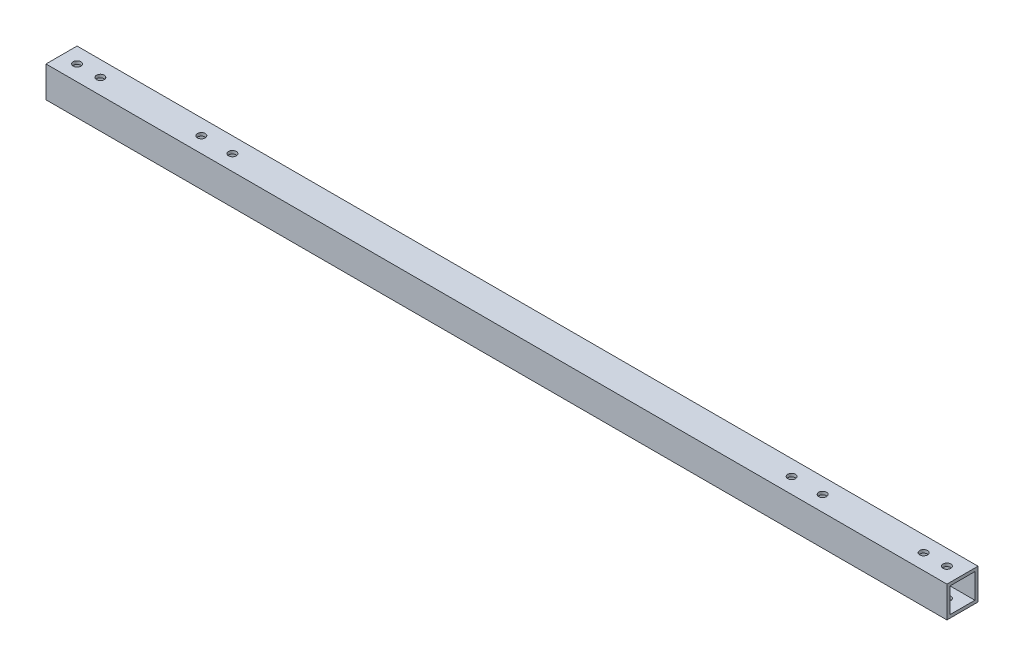
ISO-10303-21;
HEADER;
FILE_DESCRIPTION(('STEP AP214'),'2;1');
FILE_NAME('part.step','',(''),(''),'','','');
FILE_SCHEMA(('AUTOMOTIVE_DESIGN { 1 0 10303 214 1 1 1 1 }'));
ENDSEC;
DATA;
#1=APPLICATION_CONTEXT('core data for automotive mechanical design processes');
#2=APPLICATION_PROTOCOL_DEFINITION('international standard','automotive_design',2000,#1);
#3=PRODUCT_CONTEXT('',#1,'mechanical');
#4=PRODUCT('Part','Part','',(#3));
#5=PRODUCT_RELATED_PRODUCT_CATEGORY('part','',(#4));
#6=PRODUCT_DEFINITION_FORMATION('','',#4);
#7=PRODUCT_DEFINITION_CONTEXT('part definition',#1,'design');
#8=PRODUCT_DEFINITION('design','',#6,#7);
#9=PRODUCT_DEFINITION_SHAPE('','',#8);
#10=(LENGTH_UNIT() NAMED_UNIT(*) SI_UNIT(.MILLI.,.METRE.));
#11=(NAMED_UNIT(*) PLANE_ANGLE_UNIT() SI_UNIT($,.RADIAN.));
#12=(NAMED_UNIT(*) SI_UNIT($,.STERADIAN.) SOLID_ANGLE_UNIT());
#13=UNCERTAINTY_MEASURE_WITH_UNIT(LENGTH_MEASURE(1.E-05),#10,'distance_accuracy_value','');
#14=(GEOMETRIC_REPRESENTATION_CONTEXT(3) GLOBAL_UNCERTAINTY_ASSIGNED_CONTEXT((#13)) GLOBAL_UNIT_ASSIGNED_CONTEXT((#10,
#11,#12)) REPRESENTATION_CONTEXT('',''));
#15=CARTESIAN_POINT('',(0.,0.,0.));
#16=DIRECTION('',(0.,0.,1.));
#17=DIRECTION('',(1.,0.,0.));
#18=AXIS2_PLACEMENT_3D('',#15,#16,#17);
#19=CARTESIAN_POINT('',(580.,0.,0.));
#20=DIRECTION('',(1.,0.,0.));
#21=DIRECTION('',(0.,0.,-1.));
#22=AXIS2_PLACEMENT_3D('',#19,#20,#21);
#23=PLANE('',#22);
#24=DIRECTION('',(0.,1.,0.));
#25=VECTOR('',#24,1.);
#26=CARTESIAN_POINT('',(580.,10.,-9.99999999999999));
#27=LINE('',#26,#25);
#28=CARTESIAN_POINT('',(580.,-10.,-10.));
#29=VERTEX_POINT('',#28);
#30=CARTESIAN_POINT('',(580.,10.,-9.99999999999999));
#31=VERTEX_POINT('',#30);
#32=EDGE_CURVE('E141',#29,#31,#27,.T.);
#33=ORIENTED_EDGE('',*,*,#32,.T.);
#34=DIRECTION('',(0.,0.,1.));
#35=VECTOR('',#34,1.);
#36=CARTESIAN_POINT('',(580.,10.,10.));
#37=LINE('',#36,#35);
#38=CARTESIAN_POINT('',(580.,10.,10.));
#39=VERTEX_POINT('',#38);
#40=EDGE_CURVE('E144',#31,#39,#37,.T.);
#41=ORIENTED_EDGE('',*,*,#40,.T.);
#42=DIRECTION('',(0.,-1.,0.));
#43=VECTOR('',#42,1.);
#44=CARTESIAN_POINT('',(580.,10.,10.));
#45=LINE('',#44,#43);
#46=CARTESIAN_POINT('',(580.,-10.,10.));
#47=VERTEX_POINT('',#46);
#48=EDGE_CURVE('E147',#39,#47,#45,.T.);
#49=ORIENTED_EDGE('',*,*,#48,.T.);
#50=DIRECTION('',(0.,0.,-1.));
#51=VECTOR('',#50,1.);
#52=CARTESIAN_POINT('',(580.,-10.,10.));
#53=LINE('',#52,#51);
#54=EDGE_CURVE('E149',#47,#29,#53,.T.);
#55=ORIENTED_EDGE('',*,*,#54,.T.);
#56=EDGE_LOOP('',(#33,#41,#49,#55));
#57=FACE_BOUND('',#56,.T.);
#58=DIRECTION('',(0.,0.,1.));
#59=VECTOR('',#58,1.);
#60=CARTESIAN_POINT('',(580.,8.,8.));
#61=LINE('',#60,#59);
#62=CARTESIAN_POINT('',(580.,8.,-8.));
#63=VERTEX_POINT('',#62);
#64=CARTESIAN_POINT('',(580.,8.,8.));
#65=VERTEX_POINT('',#64);
#66=EDGE_CURVE('E111',#63,#65,#61,.T.);
#67=ORIENTED_EDGE('',*,*,#66,.F.);
#68=DIRECTION('',(0.,1.,0.));
#69=VECTOR('',#68,1.);
#70=CARTESIAN_POINT('',(580.,8.,-8.));
#71=LINE('',#70,#69);
#72=CARTESIAN_POINT('',(580.,-8.,-8.));
#73=VERTEX_POINT('',#72);
#74=EDGE_CURVE('E103',#73,#63,#71,.T.);
#75=ORIENTED_EDGE('',*,*,#74,.F.);
#76=DIRECTION('',(0.,0.,-1.));
#77=VECTOR('',#76,1.);
#78=CARTESIAN_POINT('',(580.,-8.,8.));
#79=LINE('',#78,#77);
#80=CARTESIAN_POINT('',(580.,-8.,8.));
#81=VERTEX_POINT('',#80);
#82=EDGE_CURVE('E125',#81,#73,#79,.T.);
#83=ORIENTED_EDGE('',*,*,#82,.F.);
#84=DIRECTION('',(0.,-1.,0.));
#85=VECTOR('',#84,1.);
#86=CARTESIAN_POINT('',(580.,8.,8.));
#87=LINE('',#86,#85);
#88=EDGE_CURVE('E123',#65,#81,#87,.T.);
#89=ORIENTED_EDGE('',*,*,#88,.F.);
#90=EDGE_LOOP('',(#67,#75,#83,#89));
#91=FACE_BOUND('',#90,.T.);
#92=ADVANCED_FACE('F36',(#57,#91),#23,.T.);
#93=CARTESIAN_POINT('',(0.,0.,0.));
#94=DIRECTION('',(1.,0.,0.));
#95=DIRECTION('',(0.,0.,-1.));
#96=AXIS2_PLACEMENT_3D('',#93,#94,#95);
#97=PLANE('',#96);
#98=DIRECTION('',(0.,1.,0.));
#99=VECTOR('',#98,1.);
#100=CARTESIAN_POINT('',(0.,10.,-9.99999999999999));
#101=LINE('',#100,#99);
#102=CARTESIAN_POINT('',(0.,-10.,-10.));
#103=VERTEX_POINT('',#102);
#104=CARTESIAN_POINT('',(0.,10.,-9.99999999999999));
#105=VERTEX_POINT('',#104);
#106=EDGE_CURVE('E119',#103,#105,#101,.T.);
#107=ORIENTED_EDGE('',*,*,#106,.F.);
#108=DIRECTION('',(0.,0.,-1.));
#109=VECTOR('',#108,1.);
#110=CARTESIAN_POINT('',(0.,-10.,10.));
#111=LINE('',#110,#109);
#112=CARTESIAN_POINT('',(0.,-10.,10.));
#113=VERTEX_POINT('',#112);
#114=EDGE_CURVE('E145',#113,#103,#111,.T.);
#115=ORIENTED_EDGE('',*,*,#114,.F.);
#116=DIRECTION('',(0.,-1.,0.));
#117=VECTOR('',#116,1.);
#118=CARTESIAN_POINT('',(0.,10.,10.));
#119=LINE('',#118,#117);
#120=CARTESIAN_POINT('',(0.,10.,10.));
#121=VERTEX_POINT('',#120);
#122=EDGE_CURVE('E156',#121,#113,#119,.T.);
#123=ORIENTED_EDGE('',*,*,#122,.F.);
#124=DIRECTION('',(0.,0.,1.));
#125=VECTOR('',#124,1.);
#126=CARTESIAN_POINT('',(0.,10.,10.));
#127=LINE('',#126,#125);
#128=EDGE_CURVE('E154',#105,#121,#127,.T.);
#129=ORIENTED_EDGE('',*,*,#128,.F.);
#130=EDGE_LOOP('',(#107,#115,#123,#129));
#131=FACE_BOUND('',#130,.T.);
#132=DIRECTION('',(0.,1.,0.));
#133=VECTOR('',#132,1.);
#134=CARTESIAN_POINT('',(0.,8.,-8.));
#135=LINE('',#134,#133);
#136=CARTESIAN_POINT('',(0.,-8.,-8.));
#137=VERTEX_POINT('',#136);
#138=CARTESIAN_POINT('',(0.,8.,-8.));
#139=VERTEX_POINT('',#138);
#140=EDGE_CURVE('E61',#137,#139,#135,.T.);
#141=ORIENTED_EDGE('',*,*,#140,.T.);
#142=DIRECTION('',(0.,0.,1.));
#143=VECTOR('',#142,1.);
#144=CARTESIAN_POINT('',(0.,8.,8.));
#145=LINE('',#144,#143);
#146=CARTESIAN_POINT('',(0.,8.,8.));
#147=VERTEX_POINT('',#146);
#148=EDGE_CURVE('E118',#139,#147,#145,.T.);
#149=ORIENTED_EDGE('',*,*,#148,.T.);
#150=DIRECTION('',(0.,-1.,0.));
#151=VECTOR('',#150,1.);
#152=CARTESIAN_POINT('',(0.,8.,8.));
#153=LINE('',#152,#151);
#154=CARTESIAN_POINT('',(0.,-8.,8.));
#155=VERTEX_POINT('',#154);
#156=EDGE_CURVE('E133',#147,#155,#153,.T.);
#157=ORIENTED_EDGE('',*,*,#156,.T.);
#158=DIRECTION('',(0.,0.,-1.));
#159=VECTOR('',#158,1.);
#160=CARTESIAN_POINT('',(0.,-8.,8.));
#161=LINE('',#160,#159);
#162=EDGE_CURVE('E112',#155,#137,#161,.T.);
#163=ORIENTED_EDGE('',*,*,#162,.T.);
#164=EDGE_LOOP('',(#141,#149,#157,#163));
#165=FACE_BOUND('',#164,.T.);
#166=ADVANCED_FACE('F275',(#131,#165),#97,.F.);
#167=CARTESIAN_POINT('',(580.,10.,-9.99999999999999));
#168=DIRECTION('',(0.,0.,1.));
#169=DIRECTION('',(0.,-1.,0.));
#170=AXIS2_PLACEMENT_3D('',#167,#168,#169);
#171=PLANE('',#170);
#172=ORIENTED_EDGE('',*,*,#106,.T.);
#173=DIRECTION('',(-1.,0.,0.));
#174=VECTOR('',#173,1.);
#175=CARTESIAN_POINT('',(580.,10.,-9.99999999999999));
#176=LINE('',#175,#174);
#177=EDGE_CURVE('E11',#31,#105,#176,.T.);
#178=ORIENTED_EDGE('',*,*,#177,.F.);
#179=ORIENTED_EDGE('',*,*,#32,.F.);
#180=DIRECTION('',(-1.,0.,0.));
#181=VECTOR('',#180,1.);
#182=CARTESIAN_POINT('',(580.,-10.,-10.));
#183=LINE('',#182,#181);
#184=EDGE_CURVE('E151',#29,#103,#183,.T.);
#185=ORIENTED_EDGE('',*,*,#184,.T.);
#186=EDGE_LOOP('',(#172,#178,#179,#185));
#187=FACE_BOUND('',#186,.T.);
#188=ADVANCED_FACE('F38',(#187),#171,.F.);
#189=CARTESIAN_POINT('',(580.,10.,10.));
#190=DIRECTION('',(0.,-1.,0.));
#191=DIRECTION('',(0.,0.,-1.));
#192=AXIS2_PLACEMENT_3D('',#189,#190,#191);
#193=PLANE('',#192);
#194=CARTESIAN_POINT('',(90.,10.,0.));
#195=DIRECTION('',(0.,1.,0.));
#196=DIRECTION('',(0.,0.,1.));
#197=AXIS2_PLACEMENT_3D('',#194,#195,#196);
#198=CIRCLE('',#197,2.49999999999999);
#199=CARTESIAN_POINT('',(90.,10.,2.49999999999999));
#200=VERTEX_POINT('',#199);
#201=EDGE_CURVE('E484',#200,#200,#198,.T.);
#202=ORIENTED_EDGE('',*,*,#201,.F.);
#203=EDGE_LOOP('',(#202));
#204=FACE_BOUND('',#203,.T.);
#205=CARTESIAN_POINT('',(490.,10.,0.));
#206=DIRECTION('',(0.,1.,0.));
#207=DIRECTION('',(0.,0.,-1.));
#208=AXIS2_PLACEMENT_3D('',#205,#206,#207);
#209=CIRCLE('',#208,2.50000000000002);
#210=CARTESIAN_POINT('',(490.,10.,-2.50000000000007));
#211=VERTEX_POINT('',#210);
#212=EDGE_CURVE('E492',#211,#211,#209,.T.);
#213=ORIENTED_EDGE('',*,*,#212,.F.);
#214=EDGE_LOOP('',(#213));
#215=FACE_BOUND('',#214,.T.);
#216=CARTESIAN_POINT('',(470.,10.,0.));
#217=DIRECTION('',(0.,1.,0.));
#218=DIRECTION('',(0.,0.,-1.));
#219=AXIS2_PLACEMENT_3D('',#216,#217,#218);
#220=CIRCLE('',#219,2.49999999999991);
#221=CARTESIAN_POINT('',(470.,10.,-2.49999999999995));
#222=VERTEX_POINT('',#221);
#223=EDGE_CURVE('E530',#222,#222,#220,.T.);
#224=ORIENTED_EDGE('',*,*,#223,.F.);
#225=EDGE_LOOP('',(#224));
#226=FACE_BOUND('',#225,.T.);
#227=CARTESIAN_POINT('',(110.,10.,0.));
#228=DIRECTION('',(0.,1.,0.));
#229=DIRECTION('',(0.,0.,1.));
#230=AXIS2_PLACEMENT_3D('',#227,#228,#229);
#231=CIRCLE('',#230,2.49999999999997);
#232=CARTESIAN_POINT('',(110.,10.,2.49999999999997));
#233=VERTEX_POINT('',#232);
#234=EDGE_CURVE('E489',#233,#233,#231,.T.);
#235=ORIENTED_EDGE('',*,*,#234,.F.);
#236=EDGE_LOOP('',(#235));
#237=FACE_BOUND('',#236,.T.);
#238=CARTESIAN_POINT('',(10.,10.,0.));
#239=DIRECTION('',(0.,1.,0.));
#240=DIRECTION('',(0.,0.,1.));
#241=AXIS2_PLACEMENT_3D('',#238,#239,#240);
#242=CIRCLE('',#241,2.5);
#243=CARTESIAN_POINT('',(10.,10.,2.5));
#244=VERTEX_POINT('',#243);
#245=EDGE_CURVE('E210',#244,#244,#242,.T.);
#246=ORIENTED_EDGE('',*,*,#245,.F.);
#247=EDGE_LOOP('',(#246));
#248=FACE_BOUND('',#247,.T.);
#249=CARTESIAN_POINT('',(555.,10.,1.04744440165294E-13));
#250=DIRECTION('',(0.,1.,0.));
#251=DIRECTION('',(0.,0.,1.));
#252=AXIS2_PLACEMENT_3D('',#249,#250,#251);
#253=CIRCLE('',#252,2.50000000000003);
#254=CARTESIAN_POINT('',(555.,10.,2.50000000000013));
#255=VERTEX_POINT('',#254);
#256=EDGE_CURVE('E207',#255,#255,#253,.T.);
#257=ORIENTED_EDGE('',*,*,#256,.F.);
#258=EDGE_LOOP('',(#257));
#259=FACE_BOUND('',#258,.T.);
#260=CARTESIAN_POINT('',(25.,10.,0.));
#261=DIRECTION('',(0.,1.,0.));
#262=DIRECTION('',(0.,0.,1.));
#263=AXIS2_PLACEMENT_3D('',#260,#261,#262);
#264=CIRCLE('',#263,2.5);
#265=CARTESIAN_POINT('',(25.,10.,2.5));
#266=VERTEX_POINT('',#265);
#267=EDGE_CURVE('E217',#266,#266,#264,.T.);
#268=ORIENTED_EDGE('',*,*,#267,.F.);
#269=EDGE_LOOP('',(#268));
#270=FACE_BOUND('',#269,.T.);
#271=CARTESIAN_POINT('',(570.,10.,0.));
#272=DIRECTION('',(0.,1.,0.));
#273=DIRECTION('',(0.,0.,1.));
#274=AXIS2_PLACEMENT_3D('',#271,#272,#273);
#275=CIRCLE('',#274,2.50000000000003);
#276=CARTESIAN_POINT('',(570.,10.,2.50000000000003));
#277=VERTEX_POINT('',#276);
#278=EDGE_CURVE('E222',#277,#277,#275,.T.);
#279=ORIENTED_EDGE('',*,*,#278,.F.);
#280=EDGE_LOOP('',(#279));
#281=FACE_BOUND('',#280,.T.);
#282=ORIENTED_EDGE('',*,*,#128,.T.);
#283=DIRECTION('',(-1.,0.,0.));
#284=VECTOR('',#283,1.);
#285=CARTESIAN_POINT('',(580.,10.,10.));
#286=LINE('',#285,#284);
#287=EDGE_CURVE('E45',#39,#121,#286,.T.);
#288=ORIENTED_EDGE('',*,*,#287,.F.);
#289=ORIENTED_EDGE('',*,*,#40,.F.);
#290=ORIENTED_EDGE('',*,*,#177,.T.);
#291=EDGE_LOOP('',(#282,#288,#289,#290));
#292=FACE_BOUND('',#291,.T.);
#293=ADVANCED_FACE('F261',(#204,#215,#226,#237,#248,#259,#270,#281,#292),#193,.F.);
#294=CARTESIAN_POINT('',(580.,10.,10.));
#295=DIRECTION('',(0.,0.,-1.));
#296=DIRECTION('',(0.,1.,0.));
#297=AXIS2_PLACEMENT_3D('',#294,#295,#296);
#298=PLANE('',#297);
#299=ORIENTED_EDGE('',*,*,#122,.T.);
#300=DIRECTION('',(-1.,0.,0.));
#301=VECTOR('',#300,1.);
#302=CARTESIAN_POINT('',(580.,-10.,10.));
#303=LINE('',#302,#301);
#304=EDGE_CURVE('E161',#47,#113,#303,.T.);
#305=ORIENTED_EDGE('',*,*,#304,.F.);
#306=ORIENTED_EDGE('',*,*,#48,.F.);
#307=ORIENTED_EDGE('',*,*,#287,.T.);
#308=EDGE_LOOP('',(#299,#305,#306,#307));
#309=FACE_BOUND('',#308,.T.);
#310=ADVANCED_FACE('F264',(#309),#298,.F.);
#311=CARTESIAN_POINT('',(580.,-10.,10.));
#312=DIRECTION('',(0.,1.,0.));
#313=DIRECTION('',(0.,0.,1.));
#314=AXIS2_PLACEMENT_3D('',#311,#312,#313);
#315=PLANE('',#314);
#316=CARTESIAN_POINT('',(90.,-10.,0.));
#317=DIRECTION('',(0.,1.,0.));
#318=DIRECTION('',(0.,0.,1.));
#319=AXIS2_PLACEMENT_3D('',#316,#317,#318);
#320=CIRCLE('',#319,2.49999999999999);
#321=CARTESIAN_POINT('',(90.,-10.,2.49999999999999));
#322=VERTEX_POINT('',#321);
#323=EDGE_CURVE('E485',#322,#322,#320,.T.);
#324=ORIENTED_EDGE('',*,*,#323,.T.);
#325=EDGE_LOOP('',(#324));
#326=FACE_BOUND('',#325,.T.);
#327=CARTESIAN_POINT('',(490.,-10.,0.));
#328=DIRECTION('',(0.,1.,0.));
#329=DIRECTION('',(0.,0.,-1.));
#330=AXIS2_PLACEMENT_3D('',#327,#328,#329);
#331=CIRCLE('',#330,2.50000000000002);
#332=CARTESIAN_POINT('',(490.,-10.,-2.50000000000007));
#333=VERTEX_POINT('',#332);
#334=EDGE_CURVE('E486',#333,#333,#331,.T.);
#335=ORIENTED_EDGE('',*,*,#334,.T.);
#336=EDGE_LOOP('',(#335));
#337=FACE_BOUND('',#336,.T.);
#338=CARTESIAN_POINT('',(470.,-10.,0.));
#339=DIRECTION('',(0.,1.,0.));
#340=DIRECTION('',(0.,0.,-1.));
#341=AXIS2_PLACEMENT_3D('',#338,#339,#340);
#342=CIRCLE('',#341,2.49999999999991);
#343=CARTESIAN_POINT('',(470.,-10.,-2.49999999999995));
#344=VERTEX_POINT('',#343);
#345=EDGE_CURVE('E498',#344,#344,#342,.T.);
#346=ORIENTED_EDGE('',*,*,#345,.T.);
#347=EDGE_LOOP('',(#346));
#348=FACE_BOUND('',#347,.T.);
#349=CARTESIAN_POINT('',(110.,-10.,0.));
#350=DIRECTION('',(0.,1.,0.));
#351=DIRECTION('',(0.,0.,1.));
#352=AXIS2_PLACEMENT_3D('',#349,#350,#351);
#353=CIRCLE('',#352,2.49999999999997);
#354=CARTESIAN_POINT('',(110.,-10.,2.49999999999997));
#355=VERTEX_POINT('',#354);
#356=EDGE_CURVE('E186',#355,#355,#353,.T.);
#357=ORIENTED_EDGE('',*,*,#356,.T.);
#358=EDGE_LOOP('',(#357));
#359=FACE_BOUND('',#358,.T.);
#360=CARTESIAN_POINT('',(10.,-10.,0.));
#361=DIRECTION('',(0.,1.,0.));
#362=DIRECTION('',(0.,0.,1.));
#363=AXIS2_PLACEMENT_3D('',#360,#361,#362);
#364=CIRCLE('',#363,2.5);
#365=CARTESIAN_POINT('',(10.,-10.,2.5));
#366=VERTEX_POINT('',#365);
#367=EDGE_CURVE('E170',#366,#366,#364,.T.);
#368=ORIENTED_EDGE('',*,*,#367,.T.);
#369=EDGE_LOOP('',(#368));
#370=FACE_BOUND('',#369,.T.);
#371=CARTESIAN_POINT('',(555.,-10.,1.04744440165294E-13));
#372=DIRECTION('',(0.,1.,0.));
#373=DIRECTION('',(0.,0.,1.));
#374=AXIS2_PLACEMENT_3D('',#371,#372,#373);
#375=CIRCLE('',#374,2.50000000000003);
#376=CARTESIAN_POINT('',(555.,-10.,2.50000000000013));
#377=VERTEX_POINT('',#376);
#378=EDGE_CURVE('E214',#377,#377,#375,.T.);
#379=ORIENTED_EDGE('',*,*,#378,.T.);
#380=EDGE_LOOP('',(#379));
#381=FACE_BOUND('',#380,.T.);
#382=CARTESIAN_POINT('',(25.,-10.,0.));
#383=DIRECTION('',(0.,1.,0.));
#384=DIRECTION('',(0.,0.,1.));
#385=AXIS2_PLACEMENT_3D('',#382,#383,#384);
#386=CIRCLE('',#385,2.5);
#387=CARTESIAN_POINT('',(25.,-10.,2.5));
#388=VERTEX_POINT('',#387);
#389=EDGE_CURVE('E225',#388,#388,#386,.T.);
#390=ORIENTED_EDGE('',*,*,#389,.T.);
#391=EDGE_LOOP('',(#390));
#392=FACE_BOUND('',#391,.T.);
#393=CARTESIAN_POINT('',(570.,-10.,0.));
#394=DIRECTION('',(0.,1.,0.));
#395=DIRECTION('',(0.,0.,1.));
#396=AXIS2_PLACEMENT_3D('',#393,#394,#395);
#397=CIRCLE('',#396,2.50000000000003);
#398=CARTESIAN_POINT('',(570.,-10.,2.50000000000003));
#399=VERTEX_POINT('',#398);
#400=EDGE_CURVE('E213',#399,#399,#397,.T.);
#401=ORIENTED_EDGE('',*,*,#400,.T.);
#402=EDGE_LOOP('',(#401));
#403=FACE_BOUND('',#402,.T.);
#404=ORIENTED_EDGE('',*,*,#114,.T.);
#405=ORIENTED_EDGE('',*,*,#184,.F.);
#406=ORIENTED_EDGE('',*,*,#54,.F.);
#407=ORIENTED_EDGE('',*,*,#304,.T.);
#408=EDGE_LOOP('',(#404,#405,#406,#407));
#409=FACE_BOUND('',#408,.T.);
#410=ADVANCED_FACE('F279',(#326,#337,#348,#359,#370,#381,#392,#403,#409),#315,.F.);
#411=CARTESIAN_POINT('',(580.,8.,-8.));
#412=DIRECTION('',(0.,0.,1.));
#413=DIRECTION('',(0.,-1.,0.));
#414=AXIS2_PLACEMENT_3D('',#411,#412,#413);
#415=PLANE('',#414);
#416=ORIENTED_EDGE('',*,*,#140,.F.);
#417=DIRECTION('',(-1.,0.,0.));
#418=VECTOR('',#417,1.);
#419=CARTESIAN_POINT('',(580.,-8.,-8.));
#420=LINE('',#419,#418);
#421=EDGE_CURVE('E107',#73,#137,#420,.T.);
#422=ORIENTED_EDGE('',*,*,#421,.F.);
#423=ORIENTED_EDGE('',*,*,#74,.T.);
#424=DIRECTION('',(-1.,0.,0.));
#425=VECTOR('',#424,1.);
#426=CARTESIAN_POINT('',(580.,8.,-8.));
#427=LINE('',#426,#425);
#428=EDGE_CURVE('E106',#63,#139,#427,.T.);
#429=ORIENTED_EDGE('',*,*,#428,.T.);
#430=EDGE_LOOP('',(#416,#422,#423,#429));
#431=FACE_BOUND('',#430,.T.);
#432=ADVANCED_FACE('F105',(#431),#415,.T.);
#433=CARTESIAN_POINT('',(580.,8.,8.));
#434=DIRECTION('',(0.,-1.,0.));
#435=DIRECTION('',(0.,0.,-1.));
#436=AXIS2_PLACEMENT_3D('',#433,#434,#435);
#437=PLANE('',#436);
#438=CARTESIAN_POINT('',(90.,8.,0.));
#439=DIRECTION('',(0.,-1.,0.));
#440=DIRECTION('',(0.,0.,-1.));
#441=AXIS2_PLACEMENT_3D('',#438,#439,#440);
#442=CIRCLE('',#441,2.49999999999999);
#443=CARTESIAN_POINT('',(90.,8.,-2.49999999999999));
#444=VERTEX_POINT('',#443);
#445=EDGE_CURVE('E204',#444,#444,#442,.T.);
#446=ORIENTED_EDGE('',*,*,#445,.F.);
#447=EDGE_LOOP('',(#446));
#448=FACE_BOUND('',#447,.T.);
#449=CARTESIAN_POINT('',(490.,8.,0.));
#450=DIRECTION('',(0.,-1.,0.));
#451=DIRECTION('',(0.,0.,-1.));
#452=AXIS2_PLACEMENT_3D('',#449,#450,#451);
#453=CIRCLE('',#452,2.50000000000002);
#454=CARTESIAN_POINT('',(490.,8.,-2.50000000000007));
#455=VERTEX_POINT('',#454);
#456=EDGE_CURVE('E192',#455,#455,#453,.T.);
#457=ORIENTED_EDGE('',*,*,#456,.F.);
#458=EDGE_LOOP('',(#457));
#459=FACE_BOUND('',#458,.T.);
#460=CARTESIAN_POINT('',(470.,8.,0.));
#461=DIRECTION('',(0.,-1.,0.));
#462=DIRECTION('',(0.,0.,-1.));
#463=AXIS2_PLACEMENT_3D('',#460,#461,#462);
#464=CIRCLE('',#463,2.49999999999991);
#465=CARTESIAN_POINT('',(470.,8.,-2.49999999999995));
#466=VERTEX_POINT('',#465);
#467=EDGE_CURVE('E189',#466,#466,#464,.T.);
#468=ORIENTED_EDGE('',*,*,#467,.F.);
#469=EDGE_LOOP('',(#468));
#470=FACE_BOUND('',#469,.T.);
#471=CARTESIAN_POINT('',(110.,8.,0.));
#472=DIRECTION('',(0.,-1.,0.));
#473=DIRECTION('',(0.,0.,-1.));
#474=AXIS2_PLACEMENT_3D('',#471,#472,#473);
#475=CIRCLE('',#474,2.49999999999997);
#476=CARTESIAN_POINT('',(110.,8.,-2.49999999999997));
#477=VERTEX_POINT('',#476);
#478=EDGE_CURVE('E185',#477,#477,#475,.T.);
#479=ORIENTED_EDGE('',*,*,#478,.F.);
#480=EDGE_LOOP('',(#479));
#481=FACE_BOUND('',#480,.T.);
#482=CARTESIAN_POINT('',(10.,8.,0.));
#483=DIRECTION('',(0.,-1.,0.));
#484=DIRECTION('',(0.,0.,-1.));
#485=AXIS2_PLACEMENT_3D('',#482,#483,#484);
#486=CIRCLE('',#485,2.5);
#487=CARTESIAN_POINT('',(10.,8.,-2.5));
#488=VERTEX_POINT('',#487);
#489=EDGE_CURVE('E131',#488,#488,#486,.T.);
#490=ORIENTED_EDGE('',*,*,#489,.F.);
#491=EDGE_LOOP('',(#490));
#492=FACE_BOUND('',#491,.T.);
#493=CARTESIAN_POINT('',(555.,8.,1.04744440165294E-13));
#494=DIRECTION('',(0.,-1.,0.));
#495=DIRECTION('',(0.,0.,-1.));
#496=AXIS2_PLACEMENT_3D('',#493,#494,#495);
#497=CIRCLE('',#496,2.50000000000003);
#498=CARTESIAN_POINT('',(555.,8.,-2.49999999999992));
#499=VERTEX_POINT('',#498);
#500=EDGE_CURVE('E178',#499,#499,#497,.T.);
#501=ORIENTED_EDGE('',*,*,#500,.F.);
#502=EDGE_LOOP('',(#501));
#503=FACE_BOUND('',#502,.T.);
#504=CARTESIAN_POINT('',(25.,8.,0.));
#505=DIRECTION('',(0.,-1.,0.));
#506=DIRECTION('',(0.,0.,-1.));
#507=AXIS2_PLACEMENT_3D('',#504,#505,#506);
#508=CIRCLE('',#507,2.5);
#509=CARTESIAN_POINT('',(25.,8.,-2.5));
#510=VERTEX_POINT('',#509);
#511=EDGE_CURVE('E174',#510,#510,#508,.T.);
#512=ORIENTED_EDGE('',*,*,#511,.F.);
#513=EDGE_LOOP('',(#512));
#514=FACE_BOUND('',#513,.T.);
#515=CARTESIAN_POINT('',(570.,8.,0.));
#516=DIRECTION('',(0.,-1.,0.));
#517=DIRECTION('',(0.,0.,-1.));
#518=AXIS2_PLACEMENT_3D('',#515,#516,#517);
#519=CIRCLE('',#518,2.50000000000003);
#520=CARTESIAN_POINT('',(570.,8.,-2.50000000000003));
#521=VERTEX_POINT('',#520);
#522=EDGE_CURVE('E169',#521,#521,#519,.T.);
#523=ORIENTED_EDGE('',*,*,#522,.F.);
#524=EDGE_LOOP('',(#523));
#525=FACE_BOUND('',#524,.T.);
#526=ORIENTED_EDGE('',*,*,#148,.F.);
#527=ORIENTED_EDGE('',*,*,#428,.F.);
#528=ORIENTED_EDGE('',*,*,#66,.T.);
#529=DIRECTION('',(-1.,0.,0.));
#530=VECTOR('',#529,1.);
#531=CARTESIAN_POINT('',(580.,8.,8.));
#532=LINE('',#531,#530);
#533=EDGE_CURVE('E120',#65,#147,#532,.T.);
#534=ORIENTED_EDGE('',*,*,#533,.T.);
#535=EDGE_LOOP('',(#526,#527,#528,#534));
#536=FACE_BOUND('',#535,.T.);
#537=ADVANCED_FACE('F115',(#448,#459,#470,#481,#492,#503,#514,#525,#536),#437,.T.);
#538=CARTESIAN_POINT('',(580.,8.,8.));
#539=DIRECTION('',(0.,0.,-1.));
#540=DIRECTION('',(0.,1.,0.));
#541=AXIS2_PLACEMENT_3D('',#538,#539,#540);
#542=PLANE('',#541);
#543=ORIENTED_EDGE('',*,*,#156,.F.);
#544=ORIENTED_EDGE('',*,*,#533,.F.);
#545=ORIENTED_EDGE('',*,*,#88,.T.);
#546=DIRECTION('',(-1.,0.,0.));
#547=VECTOR('',#546,1.);
#548=CARTESIAN_POINT('',(580.,-8.,8.));
#549=LINE('',#548,#547);
#550=EDGE_CURVE('E53',#81,#155,#549,.T.);
#551=ORIENTED_EDGE('',*,*,#550,.T.);
#552=EDGE_LOOP('',(#543,#544,#545,#551));
#553=FACE_BOUND('',#552,.T.);
#554=ADVANCED_FACE('F243',(#553),#542,.T.);
#555=CARTESIAN_POINT('',(580.,-8.,8.));
#556=DIRECTION('',(0.,1.,0.));
#557=DIRECTION('',(0.,0.,1.));
#558=AXIS2_PLACEMENT_3D('',#555,#556,#557);
#559=PLANE('',#558);
#560=CARTESIAN_POINT('',(90.,-8.,0.));
#561=DIRECTION('',(0.,1.,0.));
#562=DIRECTION('',(0.,0.,1.));
#563=AXIS2_PLACEMENT_3D('',#560,#561,#562);
#564=CIRCLE('',#563,2.49999999999999);
#565=CARTESIAN_POINT('',(90.,-8.,2.49999999999999));
#566=VERTEX_POINT('',#565);
#567=EDGE_CURVE('E40',#566,#566,#564,.T.);
#568=ORIENTED_EDGE('',*,*,#567,.F.);
#569=EDGE_LOOP('',(#568));
#570=FACE_BOUND('',#569,.T.);
#571=CARTESIAN_POINT('',(490.,-8.,0.));
#572=DIRECTION('',(0.,1.,0.));
#573=DIRECTION('',(0.,0.,1.));
#574=AXIS2_PLACEMENT_3D('',#571,#572,#573);
#575=CIRCLE('',#574,2.50000000000002);
#576=CARTESIAN_POINT('',(490.,-8.,2.49999999999997));
#577=VERTEX_POINT('',#576);
#578=EDGE_CURVE('E190',#577,#577,#575,.T.);
#579=ORIENTED_EDGE('',*,*,#578,.F.);
#580=EDGE_LOOP('',(#579));
#581=FACE_BOUND('',#580,.T.);
#582=CARTESIAN_POINT('',(470.,-8.,0.));
#583=DIRECTION('',(0.,1.,0.));
#584=DIRECTION('',(0.,0.,1.));
#585=AXIS2_PLACEMENT_3D('',#582,#583,#584);
#586=CIRCLE('',#585,2.49999999999991);
#587=CARTESIAN_POINT('',(470.,-8.,2.49999999999986));
#588=VERTEX_POINT('',#587);
#589=EDGE_CURVE('E187',#588,#588,#586,.T.);
#590=ORIENTED_EDGE('',*,*,#589,.F.);
#591=EDGE_LOOP('',(#590));
#592=FACE_BOUND('',#591,.T.);
#593=CARTESIAN_POINT('',(110.,-8.,0.));
#594=DIRECTION('',(0.,1.,0.));
#595=DIRECTION('',(0.,0.,1.));
#596=AXIS2_PLACEMENT_3D('',#593,#594,#595);
#597=CIRCLE('',#596,2.49999999999997);
#598=CARTESIAN_POINT('',(110.,-8.,2.49999999999997));
#599=VERTEX_POINT('',#598);
#600=EDGE_CURVE('E182',#599,#599,#597,.T.);
#601=ORIENTED_EDGE('',*,*,#600,.F.);
#602=EDGE_LOOP('',(#601));
#603=FACE_BOUND('',#602,.T.);
#604=CARTESIAN_POINT('',(10.,-8.,0.));
#605=DIRECTION('',(0.,1.,0.));
#606=DIRECTION('',(0.,0.,1.));
#607=AXIS2_PLACEMENT_3D('',#604,#605,#606);
#608=CIRCLE('',#607,2.5);
#609=CARTESIAN_POINT('',(10.,-8.,2.5));
#610=VERTEX_POINT('',#609);
#611=EDGE_CURVE('E179',#610,#610,#608,.T.);
#612=ORIENTED_EDGE('',*,*,#611,.F.);
#613=EDGE_LOOP('',(#612));
#614=FACE_BOUND('',#613,.T.);
#615=CARTESIAN_POINT('',(555.,-8.,1.04744440165294E-13));
#616=DIRECTION('',(0.,1.,0.));
#617=DIRECTION('',(0.,0.,1.));
#618=AXIS2_PLACEMENT_3D('',#615,#616,#617);
#619=CIRCLE('',#618,2.50000000000003);
#620=CARTESIAN_POINT('',(555.,-8.,2.50000000000013));
#621=VERTEX_POINT('',#620);
#622=EDGE_CURVE('E175',#621,#621,#619,.T.);
#623=ORIENTED_EDGE('',*,*,#622,.F.);
#624=EDGE_LOOP('',(#623));
#625=FACE_BOUND('',#624,.T.);
#626=CARTESIAN_POINT('',(25.,-8.,0.));
#627=DIRECTION('',(0.,1.,0.));
#628=DIRECTION('',(0.,0.,1.));
#629=AXIS2_PLACEMENT_3D('',#626,#627,#628);
#630=CIRCLE('',#629,2.5);
#631=CARTESIAN_POINT('',(25.,-8.,2.5));
#632=VERTEX_POINT('',#631);
#633=EDGE_CURVE('E171',#632,#632,#630,.T.);
#634=ORIENTED_EDGE('',*,*,#633,.F.);
#635=EDGE_LOOP('',(#634));
#636=FACE_BOUND('',#635,.T.);
#637=CARTESIAN_POINT('',(570.,-8.,0.));
#638=DIRECTION('',(0.,1.,0.));
#639=DIRECTION('',(0.,0.,1.));
#640=AXIS2_PLACEMENT_3D('',#637,#638,#639);
#641=CIRCLE('',#640,2.50000000000003);
#642=CARTESIAN_POINT('',(570.,-8.,2.50000000000003));
#643=VERTEX_POINT('',#642);
#644=EDGE_CURVE('E166',#643,#643,#641,.T.);
#645=ORIENTED_EDGE('',*,*,#644,.F.);
#646=EDGE_LOOP('',(#645));
#647=FACE_BOUND('',#646,.T.);
#648=ORIENTED_EDGE('',*,*,#162,.F.);
#649=ORIENTED_EDGE('',*,*,#550,.F.);
#650=ORIENTED_EDGE('',*,*,#82,.T.);
#651=ORIENTED_EDGE('',*,*,#421,.T.);
#652=EDGE_LOOP('',(#648,#649,#650,#651));
#653=FACE_BOUND('',#652,.T.);
#654=ADVANCED_FACE('F328',(#570,#581,#592,#603,#614,#625,#636,#647,#653),#559,.T.);
#655=CARTESIAN_POINT('',(570.,-10.,0.));
#656=DIRECTION('',(0.,1.,0.));
#657=DIRECTION('',(0.,0.,1.));
#658=AXIS2_PLACEMENT_3D('',#655,#656,#657);
#659=CYLINDRICAL_SURFACE('',#658,2.50000000000003);
#660=ORIENTED_EDGE('',*,*,#644,.T.);
#661=EDGE_LOOP('',(#660));
#662=FACE_BOUND('',#661,.T.);
#663=ORIENTED_EDGE('',*,*,#400,.F.);
#664=EDGE_LOOP('',(#663));
#665=FACE_BOUND('',#664,.T.);
#666=ADVANCED_FACE('F258',(#662,#665),#659,.F.);
#667=CARTESIAN_POINT('',(25.,-10.,0.));
#668=DIRECTION('',(0.,1.,0.));
#669=DIRECTION('',(0.,0.,1.));
#670=AXIS2_PLACEMENT_3D('',#667,#668,#669);
#671=CYLINDRICAL_SURFACE('',#670,2.5);
#672=ORIENTED_EDGE('',*,*,#633,.T.);
#673=EDGE_LOOP('',(#672));
#674=FACE_BOUND('',#673,.T.);
#675=ORIENTED_EDGE('',*,*,#389,.F.);
#676=EDGE_LOOP('',(#675));
#677=FACE_BOUND('',#676,.T.);
#678=ADVANCED_FACE('F345',(#674,#677),#671,.F.);
#679=CARTESIAN_POINT('',(555.,-10.,1.04744440165294E-13));
#680=DIRECTION('',(0.,1.,0.));
#681=DIRECTION('',(0.,0.,1.));
#682=AXIS2_PLACEMENT_3D('',#679,#680,#681);
#683=CYLINDRICAL_SURFACE('',#682,2.50000000000003);
#684=ORIENTED_EDGE('',*,*,#622,.T.);
#685=EDGE_LOOP('',(#684));
#686=FACE_BOUND('',#685,.T.);
#687=ORIENTED_EDGE('',*,*,#378,.F.);
#688=EDGE_LOOP('',(#687));
#689=FACE_BOUND('',#688,.T.);
#690=ADVANCED_FACE('F351',(#686,#689),#683,.F.);
#691=CARTESIAN_POINT('',(10.,-10.,0.));
#692=DIRECTION('',(0.,1.,0.));
#693=DIRECTION('',(0.,0.,1.));
#694=AXIS2_PLACEMENT_3D('',#691,#692,#693);
#695=CYLINDRICAL_SURFACE('',#694,2.5);
#696=ORIENTED_EDGE('',*,*,#611,.T.);
#697=EDGE_LOOP('',(#696));
#698=FACE_BOUND('',#697,.T.);
#699=ORIENTED_EDGE('',*,*,#367,.F.);
#700=EDGE_LOOP('',(#699));
#701=FACE_BOUND('',#700,.T.);
#702=ADVANCED_FACE('F256',(#698,#701),#695,.F.);
#703=ORIENTED_EDGE('',*,*,#522,.T.);
#704=EDGE_LOOP('',(#703));
#705=FACE_BOUND('',#704,.T.);
#706=ORIENTED_EDGE('',*,*,#278,.T.);
#707=EDGE_LOOP('',(#706));
#708=FACE_BOUND('',#707,.T.);
#709=ADVANCED_FACE('F252',(#705,#708),#659,.F.);
#710=ORIENTED_EDGE('',*,*,#511,.T.);
#711=EDGE_LOOP('',(#710));
#712=FACE_BOUND('',#711,.T.);
#713=ORIENTED_EDGE('',*,*,#267,.T.);
#714=EDGE_LOOP('',(#713));
#715=FACE_BOUND('',#714,.T.);
#716=ADVANCED_FACE('F255',(#712,#715),#671,.F.);
#717=ORIENTED_EDGE('',*,*,#500,.T.);
#718=EDGE_LOOP('',(#717));
#719=FACE_BOUND('',#718,.T.);
#720=ORIENTED_EDGE('',*,*,#256,.T.);
#721=EDGE_LOOP('',(#720));
#722=FACE_BOUND('',#721,.T.);
#723=ADVANCED_FACE('F361',(#719,#722),#683,.F.);
#724=ORIENTED_EDGE('',*,*,#489,.T.);
#725=EDGE_LOOP('',(#724));
#726=FACE_BOUND('',#725,.T.);
#727=ORIENTED_EDGE('',*,*,#245,.T.);
#728=EDGE_LOOP('',(#727));
#729=FACE_BOUND('',#728,.T.);
#730=ADVANCED_FACE('F238',(#726,#729),#695,.F.);
#731=CARTESIAN_POINT('',(110.,-10.,0.));
#732=DIRECTION('',(0.,1.,0.));
#733=DIRECTION('',(0.,0.,1.));
#734=AXIS2_PLACEMENT_3D('',#731,#732,#733);
#735=CYLINDRICAL_SURFACE('',#734,2.49999999999997);
#736=ORIENTED_EDGE('',*,*,#600,.T.);
#737=EDGE_LOOP('',(#736));
#738=FACE_BOUND('',#737,.T.);
#739=ORIENTED_EDGE('',*,*,#356,.F.);
#740=EDGE_LOOP('',(#739));
#741=FACE_BOUND('',#740,.T.);
#742=ADVANCED_FACE('F390',(#738,#741),#735,.F.);
#743=CARTESIAN_POINT('',(470.,-10.,0.));
#744=DIRECTION('',(0.,1.,0.));
#745=DIRECTION('',(0.,0.,1.));
#746=AXIS2_PLACEMENT_3D('',#743,#744,#745);
#747=CYLINDRICAL_SURFACE('',#746,2.49999999999991);
#748=ORIENTED_EDGE('',*,*,#589,.T.);
#749=EDGE_LOOP('',(#748));
#750=FACE_BOUND('',#749,.T.);
#751=ORIENTED_EDGE('',*,*,#345,.F.);
#752=EDGE_LOOP('',(#751));
#753=FACE_BOUND('',#752,.T.);
#754=ADVANCED_FACE('F395',(#750,#753),#747,.F.);
#755=CARTESIAN_POINT('',(490.,-10.,0.));
#756=DIRECTION('',(0.,1.,0.));
#757=DIRECTION('',(0.,0.,1.));
#758=AXIS2_PLACEMENT_3D('',#755,#756,#757);
#759=CYLINDRICAL_SURFACE('',#758,2.50000000000002);
#760=ORIENTED_EDGE('',*,*,#578,.T.);
#761=EDGE_LOOP('',(#760));
#762=FACE_BOUND('',#761,.T.);
#763=ORIENTED_EDGE('',*,*,#334,.F.);
#764=EDGE_LOOP('',(#763));
#765=FACE_BOUND('',#764,.T.);
#766=ADVANCED_FACE('F404',(#762,#765),#759,.F.);
#767=CARTESIAN_POINT('',(90.,-10.,0.));
#768=DIRECTION('',(0.,1.,0.));
#769=DIRECTION('',(0.,0.,1.));
#770=AXIS2_PLACEMENT_3D('',#767,#768,#769);
#771=CYLINDRICAL_SURFACE('',#770,2.49999999999999);
#772=ORIENTED_EDGE('',*,*,#567,.T.);
#773=EDGE_LOOP('',(#772));
#774=FACE_BOUND('',#773,.T.);
#775=ORIENTED_EDGE('',*,*,#323,.F.);
#776=EDGE_LOOP('',(#775));
#777=FACE_BOUND('',#776,.T.);
#778=ADVANCED_FACE('F413',(#774,#777),#771,.F.);
#779=ORIENTED_EDGE('',*,*,#478,.T.);
#780=EDGE_LOOP('',(#779));
#781=FACE_BOUND('',#780,.T.);
#782=ORIENTED_EDGE('',*,*,#234,.T.);
#783=EDGE_LOOP('',(#782));
#784=FACE_BOUND('',#783,.T.);
#785=ADVANCED_FACE('F398',(#781,#784),#735,.F.);
#786=ORIENTED_EDGE('',*,*,#467,.T.);
#787=EDGE_LOOP('',(#786));
#788=FACE_BOUND('',#787,.T.);
#789=ORIENTED_EDGE('',*,*,#223,.T.);
#790=EDGE_LOOP('',(#789));
#791=FACE_BOUND('',#790,.T.);
#792=ADVANCED_FACE('F407',(#788,#791),#747,.F.);
#793=ORIENTED_EDGE('',*,*,#456,.T.);
#794=EDGE_LOOP('',(#793));
#795=FACE_BOUND('',#794,.T.);
#796=ORIENTED_EDGE('',*,*,#212,.T.);
#797=EDGE_LOOP('',(#796));
#798=FACE_BOUND('',#797,.T.);
#799=ADVANCED_FACE('F415',(#795,#798),#759,.F.);
#800=ORIENTED_EDGE('',*,*,#445,.T.);
#801=EDGE_LOOP('',(#800));
#802=FACE_BOUND('',#801,.T.);
#803=ORIENTED_EDGE('',*,*,#201,.T.);
#804=EDGE_LOOP('',(#803));
#805=FACE_BOUND('',#804,.T.);
#806=ADVANCED_FACE('F423',(#802,#805),#771,.F.);
#807=CLOSED_SHELL('',(#92,#166,#188,#293,#310,#410,#432,#537,#554,#654,#666,#678,#690,#702,#709,
#716,#723,#730,#742,#754,#766,#778,#785,#792,#799,#806));
#808=MANIFOLD_SOLID_BREP('B2',#807);
#809=ADVANCED_BREP_SHAPE_REPRESENTATION('',(#18,#808),#14);
#810=SHAPE_DEFINITION_REPRESENTATION(#9,#809);
ENDSEC;
END-ISO-10303-21;
